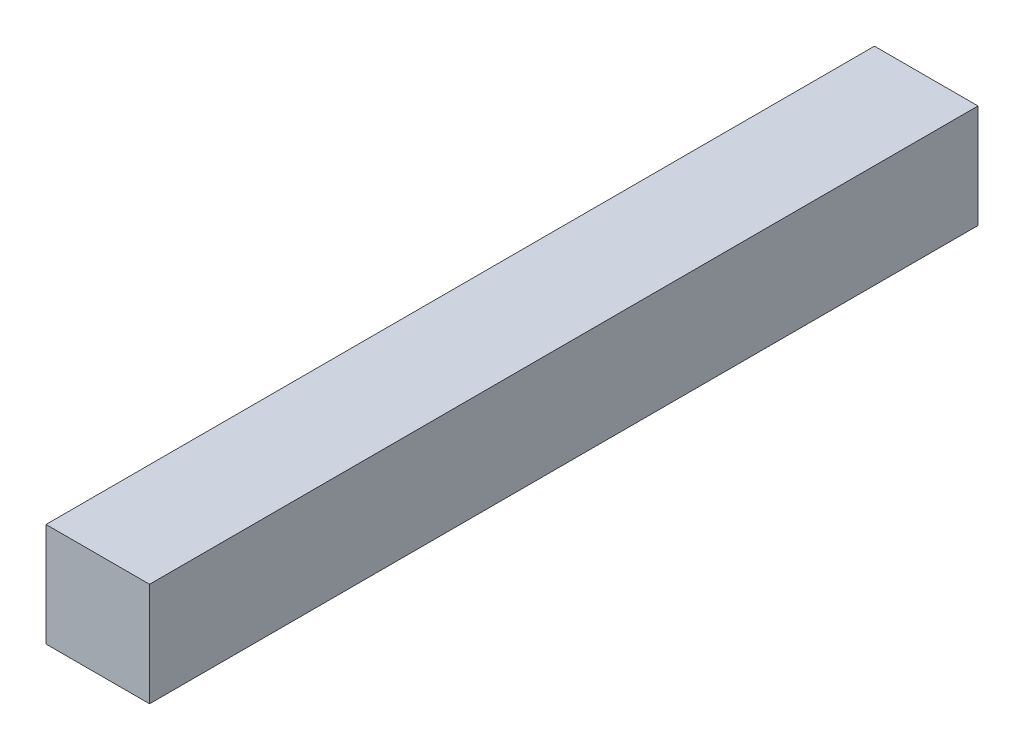
ISO-10303-21;
HEADER;
FILE_DESCRIPTION(('STEP AP214'),'2;1');
FILE_NAME('part.step','',(''),(''),'','','');
FILE_SCHEMA(('AUTOMOTIVE_DESIGN { 1 0 10303 214 1 1 1 1 }'));
ENDSEC;
DATA;
#1=APPLICATION_CONTEXT('core data for automotive mechanical design processes');
#2=APPLICATION_PROTOCOL_DEFINITION('international standard','automotive_design',2000,#1);
#3=PRODUCT_CONTEXT('',#1,'mechanical');
#4=PRODUCT('Part','Part','',(#3));
#5=PRODUCT_RELATED_PRODUCT_CATEGORY('part','',(#4));
#6=PRODUCT_DEFINITION_FORMATION('','',#4);
#7=PRODUCT_DEFINITION_CONTEXT('part definition',#1,'design');
#8=PRODUCT_DEFINITION('design','',#6,#7);
#9=PRODUCT_DEFINITION_SHAPE('','',#8);
#10=(LENGTH_UNIT() NAMED_UNIT(*) SI_UNIT(.MILLI.,.METRE.));
#11=(NAMED_UNIT(*) PLANE_ANGLE_UNIT() SI_UNIT($,.RADIAN.));
#12=(NAMED_UNIT(*) SI_UNIT($,.STERADIAN.) SOLID_ANGLE_UNIT());
#13=UNCERTAINTY_MEASURE_WITH_UNIT(LENGTH_MEASURE(1.E-05),#10,'distance_accuracy_value','');
#14=(GEOMETRIC_REPRESENTATION_CONTEXT(3) GLOBAL_UNCERTAINTY_ASSIGNED_CONTEXT((#13)) GLOBAL_UNIT_ASSIGNED_CONTEXT((#10,
#11,#12)) REPRESENTATION_CONTEXT('',''));
#15=CARTESIAN_POINT('',(0.,0.,0.));
#16=DIRECTION('',(0.,0.,1.));
#17=DIRECTION('',(1.,0.,0.));
#18=AXIS2_PLACEMENT_3D('',#15,#16,#17);
#19=CARTESIAN_POINT('',(12.5,-12.5,-200.));
#20=DIRECTION('',(1.,0.,0.));
#21=DIRECTION('',(0.,0.,-1.));
#22=AXIS2_PLACEMENT_3D('',#19,#20,#21);
#23=PLANE('',#22);
#24=DIRECTION('',(0.,1.,0.));
#25=VECTOR('',#24,1.);
#26=CARTESIAN_POINT('',(12.5,-12.5,0.));
#27=LINE('',#26,#25);
#28=CARTESIAN_POINT('',(12.5,-12.5,0.));
#29=VERTEX_POINT('',#28);
#30=CARTESIAN_POINT('',(12.5,12.5,0.));
#31=VERTEX_POINT('',#30);
#32=EDGE_CURVE('E116',#29,#31,#27,.T.);
#33=ORIENTED_EDGE('',*,*,#32,.F.);
#34=DIRECTION('',(0.,0.,1.));
#35=VECTOR('',#34,1.);
#36=CARTESIAN_POINT('',(12.5,-12.5,-200.));
#37=LINE('',#36,#35);
#38=CARTESIAN_POINT('',(12.5,-12.5,-200.));
#39=VERTEX_POINT('',#38);
#40=EDGE_CURVE('E11',#39,#29,#37,.T.);
#41=ORIENTED_EDGE('',*,*,#40,.F.);
#42=DIRECTION('',(0.,1.,0.));
#43=VECTOR('',#42,1.);
#44=CARTESIAN_POINT('',(12.5,-12.5,-200.));
#45=LINE('',#44,#43);
#46=CARTESIAN_POINT('',(12.5,12.5,-200.));
#47=VERTEX_POINT('',#46);
#48=EDGE_CURVE('E107',#39,#47,#45,.T.);
#49=ORIENTED_EDGE('',*,*,#48,.T.);
#50=DIRECTION('',(0.,0.,1.));
#51=VECTOR('',#50,1.);
#52=CARTESIAN_POINT('',(12.5,12.5,-200.));
#53=LINE('',#52,#51);
#54=EDGE_CURVE('E53',#47,#31,#53,.T.);
#55=ORIENTED_EDGE('',*,*,#54,.T.);
#56=EDGE_LOOP('',(#33,#41,#49,#55));
#57=FACE_BOUND('',#56,.T.);
#58=ADVANCED_FACE('F51',(#57),#23,.T.);
#59=CARTESIAN_POINT('',(-12.5,-12.5,-200.));
#60=DIRECTION('',(0.,-1.,0.));
#61=DIRECTION('',(0.,0.,-1.));
#62=AXIS2_PLACEMENT_3D('',#59,#60,#61);
#63=PLANE('',#62);
#64=DIRECTION('',(1.,0.,0.));
#65=VECTOR('',#64,1.);
#66=CARTESIAN_POINT('',(-12.5,-12.5,0.));
#67=LINE('',#66,#65);
#68=CARTESIAN_POINT('',(-12.5,-12.5,0.));
#69=VERTEX_POINT('',#68);
#70=EDGE_CURVE('E115',#69,#29,#67,.T.);
#71=ORIENTED_EDGE('',*,*,#70,.F.);
#72=DIRECTION('',(0.,0.,1.));
#73=VECTOR('',#72,1.);
#74=CARTESIAN_POINT('',(-12.5,-12.5,-200.));
#75=LINE('',#74,#73);
#76=CARTESIAN_POINT('',(-12.5,-12.5,-200.));
#77=VERTEX_POINT('',#76);
#78=EDGE_CURVE('E58',#77,#69,#75,.T.);
#79=ORIENTED_EDGE('',*,*,#78,.F.);
#80=DIRECTION('',(1.,0.,0.));
#81=VECTOR('',#80,1.);
#82=CARTESIAN_POINT('',(-12.5,-12.5,-200.));
#83=LINE('',#82,#81);
#84=EDGE_CURVE('E110',#77,#39,#83,.T.);
#85=ORIENTED_EDGE('',*,*,#84,.T.);
#86=ORIENTED_EDGE('',*,*,#40,.T.);
#87=EDGE_LOOP('',(#71,#79,#85,#86));
#88=FACE_BOUND('',#87,.T.);
#89=ADVANCED_FACE('F126',(#88),#63,.T.);
#90=CARTESIAN_POINT('',(-12.5,-12.5,-200.));
#91=DIRECTION('',(-1.,0.,0.));
#92=DIRECTION('',(0.,0.,1.));
#93=AXIS2_PLACEMENT_3D('',#90,#91,#92);
#94=PLANE('',#93);
#95=DIRECTION('',(0.,-1.,0.));
#96=VECTOR('',#95,1.);
#97=CARTESIAN_POINT('',(-12.5,-12.5,0.));
#98=LINE('',#97,#96);
#99=CARTESIAN_POINT('',(-12.5,12.5,0.));
#100=VERTEX_POINT('',#99);
#101=EDGE_CURVE('E102',#100,#69,#98,.T.);
#102=ORIENTED_EDGE('',*,*,#101,.F.);
#103=DIRECTION('',(0.,0.,1.));
#104=VECTOR('',#103,1.);
#105=CARTESIAN_POINT('',(-12.5,12.5,-200.));
#106=LINE('',#105,#104);
#107=CARTESIAN_POINT('',(-12.5,12.5,-200.));
#108=VERTEX_POINT('',#107);
#109=EDGE_CURVE('E96',#108,#100,#106,.T.);
#110=ORIENTED_EDGE('',*,*,#109,.F.);
#111=DIRECTION('',(0.,-1.,0.));
#112=VECTOR('',#111,1.);
#113=CARTESIAN_POINT('',(-12.5,-12.5,-200.));
#114=LINE('',#113,#112);
#115=EDGE_CURVE('E98',#108,#77,#114,.T.);
#116=ORIENTED_EDGE('',*,*,#115,.T.);
#117=ORIENTED_EDGE('',*,*,#78,.T.);
#118=EDGE_LOOP('',(#102,#110,#116,#117));
#119=FACE_BOUND('',#118,.T.);
#120=ADVANCED_FACE('F97',(#119),#94,.T.);
#121=CARTESIAN_POINT('',(-12.5,12.5,-200.));
#122=DIRECTION('',(0.,1.,0.));
#123=DIRECTION('',(0.,0.,1.));
#124=AXIS2_PLACEMENT_3D('',#121,#122,#123);
#125=PLANE('',#124);
#126=DIRECTION('',(-1.,0.,0.));
#127=VECTOR('',#126,1.);
#128=CARTESIAN_POINT('',(-12.5,12.5,0.));
#129=LINE('',#128,#127);
#130=EDGE_CURVE('E118',#31,#100,#129,.T.);
#131=ORIENTED_EDGE('',*,*,#130,.F.);
#132=ORIENTED_EDGE('',*,*,#54,.F.);
#133=DIRECTION('',(-1.,0.,0.));
#134=VECTOR('',#133,1.);
#135=CARTESIAN_POINT('',(-12.5,12.5,-200.));
#136=LINE('',#135,#134);
#137=EDGE_CURVE('E108',#47,#108,#136,.T.);
#138=ORIENTED_EDGE('',*,*,#137,.T.);
#139=ORIENTED_EDGE('',*,*,#109,.T.);
#140=EDGE_LOOP('',(#131,#132,#138,#139));
#141=FACE_BOUND('',#140,.T.);
#142=ADVANCED_FACE('F109',(#141),#125,.T.);
#143=CARTESIAN_POINT('',(0.,0.,-200.));
#144=DIRECTION('',(0.,0.,-1.));
#145=DIRECTION('',(-1.,0.,0.));
#146=AXIS2_PLACEMENT_3D('',#143,#144,#145);
#147=PLANE('',#146);
#148=ORIENTED_EDGE('',*,*,#48,.F.);
#149=ORIENTED_EDGE('',*,*,#84,.F.);
#150=ORIENTED_EDGE('',*,*,#115,.F.);
#151=ORIENTED_EDGE('',*,*,#137,.F.);
#152=EDGE_LOOP('',(#148,#149,#150,#151));
#153=FACE_BOUND('',#152,.T.);
#154=ADVANCED_FACE('F103',(#153),#147,.T.);
#155=CARTESIAN_POINT('',(0.,0.,0.));
#156=DIRECTION('',(0.,0.,-1.));
#157=DIRECTION('',(-1.,0.,0.));
#158=AXIS2_PLACEMENT_3D('',#155,#156,#157);
#159=PLANE('',#158);
#160=ORIENTED_EDGE('',*,*,#32,.T.);
#161=ORIENTED_EDGE('',*,*,#130,.T.);
#162=ORIENTED_EDGE('',*,*,#101,.T.);
#163=ORIENTED_EDGE('',*,*,#70,.T.);
#164=EDGE_LOOP('',(#160,#161,#162,#163));
#165=FACE_BOUND('',#164,.T.);
#166=ADVANCED_FACE('F130',(#165),#159,.F.);
#167=CLOSED_SHELL('',(#58,#89,#120,#142,#154,#166));
#168=MANIFOLD_SOLID_BREP('B2',#167);
#169=ADVANCED_BREP_SHAPE_REPRESENTATION('',(#18,#168),#14);
#170=SHAPE_DEFINITION_REPRESENTATION(#9,#169);
ENDSEC;
END-ISO-10303-21;
